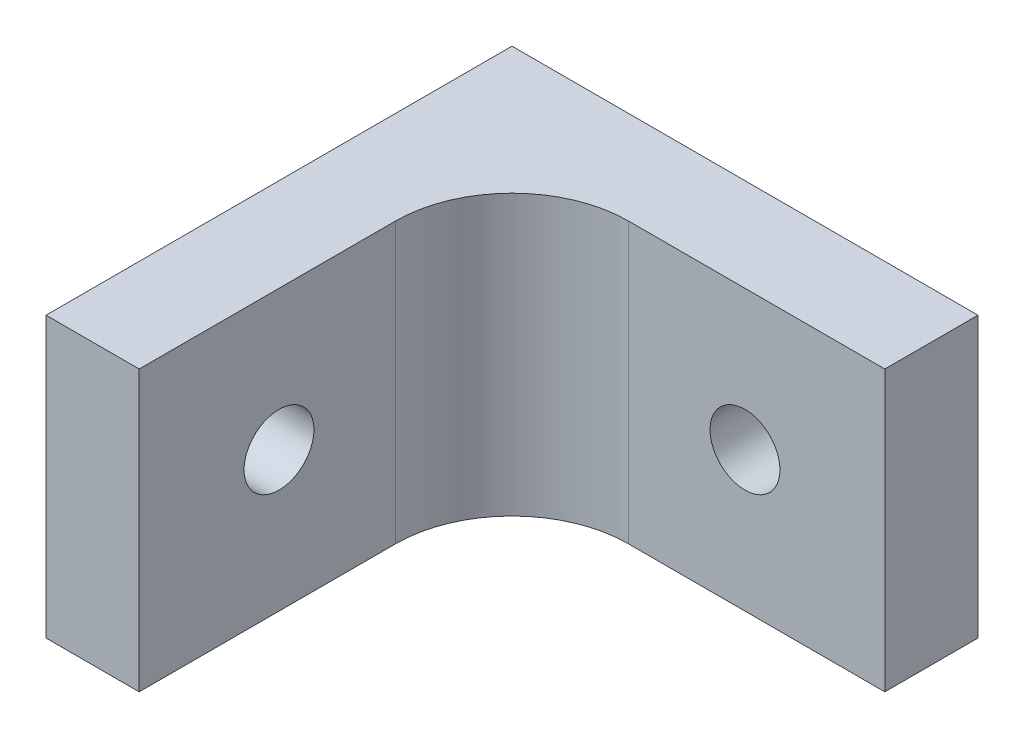
ISO-10303-21;
HEADER;
FILE_DESCRIPTION(('STEP AP214'),'2;1');
FILE_NAME('part.step','',(''),(''),'','','');
FILE_SCHEMA(('AUTOMOTIVE_DESIGN { 1 0 10303 214 1 1 1 1 }'));
ENDSEC;
DATA;
#1=APPLICATION_CONTEXT('core data for automotive mechanical design processes');
#2=APPLICATION_PROTOCOL_DEFINITION('international standard','automotive_design',2000,#1);
#3=PRODUCT_CONTEXT('',#1,'mechanical');
#4=PRODUCT('Part','Part','',(#3));
#5=PRODUCT_RELATED_PRODUCT_CATEGORY('part','',(#4));
#6=PRODUCT_DEFINITION_FORMATION('','',#4);
#7=PRODUCT_DEFINITION_CONTEXT('part definition',#1,'design');
#8=PRODUCT_DEFINITION('design','',#6,#7);
#9=PRODUCT_DEFINITION_SHAPE('','',#8);
#10=(LENGTH_UNIT() NAMED_UNIT(*) SI_UNIT(.MILLI.,.METRE.));
#11=(NAMED_UNIT(*) PLANE_ANGLE_UNIT() SI_UNIT($,.RADIAN.));
#12=(NAMED_UNIT(*) SI_UNIT($,.STERADIAN.) SOLID_ANGLE_UNIT());
#13=UNCERTAINTY_MEASURE_WITH_UNIT(LENGTH_MEASURE(1.E-05),#10,'distance_accuracy_value','');
#14=(GEOMETRIC_REPRESENTATION_CONTEXT(3) GLOBAL_UNCERTAINTY_ASSIGNED_CONTEXT((#13)) GLOBAL_UNIT_ASSIGNED_CONTEXT((#10,
#11,#12)) REPRESENTATION_CONTEXT('',''));
#15=CARTESIAN_POINT('',(0.,0.,0.));
#16=DIRECTION('',(0.,0.,1.));
#17=DIRECTION('',(1.,0.,0.));
#18=AXIS2_PLACEMENT_3D('',#15,#16,#17);
#19=CARTESIAN_POINT('',(0.,0.,2.));
#20=DIRECTION('',(0.,0.,1.));
#21=DIRECTION('',(1.,0.,0.));
#22=AXIS2_PLACEMENT_3D('',#19,#20,#21);
#23=PLANE('',#22);
#24=CARTESIAN_POINT('',(-3.,-3.,2.));
#25=DIRECTION('',(0.,0.,1.));
#26=DIRECTION('',(1.,0.,0.));
#27=AXIS2_PLACEMENT_3D('',#24,#25,#26);
#28=CIRCLE('',#27,0.75);
#29=CARTESIAN_POINT('',(-2.25,-3.,2.));
#30=VERTEX_POINT('',#29);
#31=EDGE_CURVE('E124',#30,#30,#28,.T.);
#32=ORIENTED_EDGE('',*,*,#31,.F.);
#33=EDGE_LOOP('',(#32));
#34=FACE_BOUND('',#33,.T.);
#35=DIRECTION('',(-1.,0.,0.));
#36=VECTOR('',#35,1.);
#37=CARTESIAN_POINT('',(0.,0.,2.));
#38=LINE('',#37,#36);
#39=CARTESIAN_POINT('',(0.,0.,2.));
#40=VERTEX_POINT('',#39);
#41=CARTESIAN_POINT('',(-5.5,0.,2.));
#42=VERTEX_POINT('',#41);
#43=EDGE_CURVE('E135',#40,#42,#38,.T.);
#44=ORIENTED_EDGE('',*,*,#43,.T.);
#45=DIRECTION('',(0.,-1.,0.));
#46=VECTOR('',#45,1.);
#47=CARTESIAN_POINT('',(-5.5,0.,2.));
#48=LINE('',#47,#46);
#49=CARTESIAN_POINT('',(-5.5,-6.00000000000001,2.));
#50=VERTEX_POINT('',#49);
#51=EDGE_CURVE('E156',#42,#50,#48,.T.);
#52=ORIENTED_EDGE('',*,*,#51,.T.);
#53=DIRECTION('',(1.,0.,0.));
#54=VECTOR('',#53,1.);
#55=CARTESIAN_POINT('',(0.,-6.00000000000001,2.));
#56=LINE('',#55,#54);
#57=CARTESIAN_POINT('',(0.,-6.00000000000001,2.));
#58=VERTEX_POINT('',#57);
#59=EDGE_CURVE('E136',#50,#58,#56,.T.);
#60=ORIENTED_EDGE('',*,*,#59,.T.);
#61=DIRECTION('',(0.,1.,0.));
#62=VECTOR('',#61,1.);
#63=CARTESIAN_POINT('',(0.,-6.00000000000001,2.));
#64=LINE('',#63,#62);
#65=EDGE_CURVE('E126',#58,#40,#64,.T.);
#66=ORIENTED_EDGE('',*,*,#65,.T.);
#67=EDGE_LOOP('',(#44,#52,#60,#66));
#68=FACE_BOUND('',#67,.T.);
#69=ADVANCED_FACE('F39',(#34,#68),#23,.T.);
#70=CARTESIAN_POINT('',(0.,0.,0.));
#71=DIRECTION('',(0.,0.,1.));
#72=DIRECTION('',(1.,0.,0.));
#73=AXIS2_PLACEMENT_3D('',#70,#71,#72);
#74=PLANE('',#73);
#75=DIRECTION('',(0.,-1.,0.));
#76=VECTOR('',#75,1.);
#77=CARTESIAN_POINT('',(-10.,-6.00000000000001,0.));
#78=LINE('',#77,#76);
#79=CARTESIAN_POINT('',(-10.,0.,0.));
#80=VERTEX_POINT('',#79);
#81=CARTESIAN_POINT('',(-10.,-6.00000000000001,0.));
#82=VERTEX_POINT('',#81);
#83=EDGE_CURVE('E141',#80,#82,#78,.T.);
#84=ORIENTED_EDGE('',*,*,#83,.F.);
#85=DIRECTION('',(-1.,0.,0.));
#86=VECTOR('',#85,1.);
#87=CARTESIAN_POINT('',(0.,0.,0.));
#88=LINE('',#87,#86);
#89=CARTESIAN_POINT('',(0.,0.,0.));
#90=VERTEX_POINT('',#89);
#91=EDGE_CURVE('E142',#90,#80,#88,.T.);
#92=ORIENTED_EDGE('',*,*,#91,.F.);
#93=DIRECTION('',(0.,1.,0.));
#94=VECTOR('',#93,1.);
#95=CARTESIAN_POINT('',(0.,-6.00000000000001,0.));
#96=LINE('',#95,#94);
#97=CARTESIAN_POINT('',(0.,-6.00000000000001,0.));
#98=VERTEX_POINT('',#97);
#99=EDGE_CURVE('E127',#98,#90,#96,.T.);
#100=ORIENTED_EDGE('',*,*,#99,.F.);
#101=DIRECTION('',(1.,0.,0.));
#102=VECTOR('',#101,1.);
#103=CARTESIAN_POINT('',(0.,-6.00000000000001,0.));
#104=LINE('',#103,#102);
#105=EDGE_CURVE('E134',#82,#98,#104,.T.);
#106=ORIENTED_EDGE('',*,*,#105,.F.);
#107=EDGE_LOOP('',(#84,#92,#100,#106));
#108=FACE_BOUND('',#107,.T.);
#109=CARTESIAN_POINT('',(-3.,-3.,0.));
#110=DIRECTION('',(0.,0.,1.));
#111=DIRECTION('',(1.,0.,0.));
#112=AXIS2_PLACEMENT_3D('',#109,#110,#111);
#113=CIRCLE('',#112,0.75);
#114=CARTESIAN_POINT('',(-2.25,-3.,0.));
#115=VERTEX_POINT('',#114);
#116=EDGE_CURVE('E122',#115,#115,#113,.T.);
#117=ORIENTED_EDGE('',*,*,#116,.T.);
#118=EDGE_LOOP('',(#117));
#119=FACE_BOUND('',#118,.T.);
#120=ADVANCED_FACE('F181',(#108,#119),#74,.F.);
#121=CARTESIAN_POINT('',(0.,-6.00000000000001,2.));
#122=DIRECTION('',(-1.,0.,0.));
#123=DIRECTION('',(0.,-1.,0.));
#124=AXIS2_PLACEMENT_3D('',#121,#122,#123);
#125=PLANE('',#124);
#126=ORIENTED_EDGE('',*,*,#99,.T.);
#127=DIRECTION('',(0.,0.,-1.));
#128=VECTOR('',#127,1.);
#129=CARTESIAN_POINT('',(0.,0.,2.));
#130=LINE('',#129,#128);
#131=EDGE_CURVE('E154',#40,#90,#130,.T.);
#132=ORIENTED_EDGE('',*,*,#131,.F.);
#133=ORIENTED_EDGE('',*,*,#65,.F.);
#134=DIRECTION('',(0.,0.,-1.));
#135=VECTOR('',#134,1.);
#136=CARTESIAN_POINT('',(0.,-6.00000000000001,2.));
#137=LINE('',#136,#135);
#138=EDGE_CURVE('E137',#58,#98,#137,.T.);
#139=ORIENTED_EDGE('',*,*,#138,.T.);
#140=EDGE_LOOP('',(#126,#132,#133,#139));
#141=FACE_BOUND('',#140,.T.);
#142=ADVANCED_FACE('F169',(#141),#125,.F.);
#143=CARTESIAN_POINT('',(0.,0.,2.));
#144=DIRECTION('',(0.,-1.,0.));
#145=DIRECTION('',(0.,0.,-1.));
#146=AXIS2_PLACEMENT_3D('',#143,#144,#145);
#147=PLANE('',#146);
#148=DIRECTION('',(0.,0.,-1.));
#149=VECTOR('',#148,1.);
#150=CARTESIAN_POINT('',(-10.,0.,2.));
#151=LINE('',#150,#149);
#152=CARTESIAN_POINT('',(-10.,0.,10.));
#153=VERTEX_POINT('',#152);
#154=EDGE_CURVE('E148',#153,#80,#151,.T.);
#155=ORIENTED_EDGE('',*,*,#154,.F.);
#156=DIRECTION('',(-1.,0.,0.));
#157=VECTOR('',#156,1.);
#158=CARTESIAN_POINT('',(-8.,0.,10.));
#159=LINE('',#158,#157);
#160=CARTESIAN_POINT('',(-8.,0.,10.));
#161=VERTEX_POINT('',#160);
#162=EDGE_CURVE('E109',#161,#153,#159,.T.);
#163=ORIENTED_EDGE('',*,*,#162,.F.);
#164=DIRECTION('',(0.,0.,-1.));
#165=VECTOR('',#164,1.);
#166=CARTESIAN_POINT('',(-8.,0.,0.));
#167=LINE('',#166,#165);
#168=CARTESIAN_POINT('',(-8.,0.,4.5));
#169=VERTEX_POINT('',#168);
#170=EDGE_CURVE('E111',#161,#169,#167,.T.);
#171=ORIENTED_EDGE('',*,*,#170,.T.);
#172=CARTESIAN_POINT('',(-5.5,0.,4.5));
#173=DIRECTION('',(0.,-1.,0.));
#174=DIRECTION('',(0.,0.,-1.));
#175=AXIS2_PLACEMENT_3D('',#172,#173,#174);
#176=CIRCLE('',#175,2.5);
#177=EDGE_CURVE('E11',#169,#42,#176,.T.);
#178=ORIENTED_EDGE('',*,*,#177,.T.);
#179=ORIENTED_EDGE('',*,*,#43,.F.);
#180=ORIENTED_EDGE('',*,*,#131,.T.);
#181=ORIENTED_EDGE('',*,*,#91,.T.);
#182=EDGE_LOOP('',(#155,#163,#171,#178,#179,#180,#181));
#183=FACE_BOUND('',#182,.T.);
#184=ADVANCED_FACE('F171',(#183),#147,.F.);
#185=CARTESIAN_POINT('',(-10.,-6.00000000000001,2.));
#186=DIRECTION('',(1.,0.,0.));
#187=DIRECTION('',(0.,0.,-1.));
#188=AXIS2_PLACEMENT_3D('',#185,#186,#187);
#189=PLANE('',#188);
#190=ORIENTED_EDGE('',*,*,#83,.T.);
#191=DIRECTION('',(0.,0.,-1.));
#192=VECTOR('',#191,1.);
#193=CARTESIAN_POINT('',(-10.,-6.00000000000001,2.));
#194=LINE('',#193,#192);
#195=CARTESIAN_POINT('',(-10.,-6.,10.));
#196=VERTEX_POINT('',#195);
#197=EDGE_CURVE('E149',#196,#82,#194,.T.);
#198=ORIENTED_EDGE('',*,*,#197,.F.);
#199=DIRECTION('',(0.,1.,0.));
#200=VECTOR('',#199,1.);
#201=CARTESIAN_POINT('',(-10.,0.,10.));
#202=LINE('',#201,#200);
#203=EDGE_CURVE('E101',#196,#153,#202,.T.);
#204=ORIENTED_EDGE('',*,*,#203,.T.);
#205=ORIENTED_EDGE('',*,*,#154,.T.);
#206=EDGE_LOOP('',(#190,#198,#204,#205));
#207=FACE_BOUND('',#206,.T.);
#208=CARTESIAN_POINT('',(-10.,-3.,7.));
#209=DIRECTION('',(-1.,0.,0.));
#210=DIRECTION('',(0.,0.,1.));
#211=AXIS2_PLACEMENT_3D('',#208,#209,#210);
#212=CIRCLE('',#211,0.749999999999999);
#213=CARTESIAN_POINT('',(-10.,-3.,7.75));
#214=VERTEX_POINT('',#213);
#215=EDGE_CURVE('E281',#214,#214,#212,.T.);
#216=ORIENTED_EDGE('',*,*,#215,.F.);
#217=EDGE_LOOP('',(#216));
#218=FACE_BOUND('',#217,.T.);
#219=ADVANCED_FACE('F200',(#207,#218),#189,.F.);
#220=CARTESIAN_POINT('',(0.,-6.00000000000001,2.));
#221=DIRECTION('',(0.,1.,0.));
#222=DIRECTION('',(0.,0.,1.));
#223=AXIS2_PLACEMENT_3D('',#220,#221,#222);
#224=PLANE('',#223);
#225=ORIENTED_EDGE('',*,*,#105,.T.);
#226=ORIENTED_EDGE('',*,*,#138,.F.);
#227=ORIENTED_EDGE('',*,*,#59,.F.);
#228=CARTESIAN_POINT('',(-5.5,-6.00000000000001,4.5));
#229=DIRECTION('',(0.,1.,0.));
#230=DIRECTION('',(0.,0.,1.));
#231=AXIS2_PLACEMENT_3D('',#228,#229,#230);
#232=CIRCLE('',#231,2.5);
#233=CARTESIAN_POINT('',(-8.,-6.,4.5));
#234=VERTEX_POINT('',#233);
#235=EDGE_CURVE('E50',#50,#234,#232,.T.);
#236=ORIENTED_EDGE('',*,*,#235,.T.);
#237=DIRECTION('',(0.,0.,1.));
#238=VECTOR('',#237,1.);
#239=CARTESIAN_POINT('',(-8.,-6.,0.));
#240=LINE('',#239,#238);
#241=CARTESIAN_POINT('',(-8.,-6.,10.));
#242=VERTEX_POINT('',#241);
#243=EDGE_CURVE('E94',#234,#242,#240,.T.);
#244=ORIENTED_EDGE('',*,*,#243,.T.);
#245=DIRECTION('',(-1.,0.,0.));
#246=VECTOR('',#245,1.);
#247=CARTESIAN_POINT('',(-8.,-6.,10.));
#248=LINE('',#247,#246);
#249=EDGE_CURVE('E100',#242,#196,#248,.T.);
#250=ORIENTED_EDGE('',*,*,#249,.T.);
#251=ORIENTED_EDGE('',*,*,#197,.T.);
#252=EDGE_LOOP('',(#225,#226,#227,#236,#244,#250,#251));
#253=FACE_BOUND('',#252,.T.);
#254=ADVANCED_FACE('F97',(#253),#224,.F.);
#255=CARTESIAN_POINT('',(-3.,-3.,2.));
#256=DIRECTION('',(0.,0.,-1.));
#257=DIRECTION('',(-1.,0.,0.));
#258=AXIS2_PLACEMENT_3D('',#255,#256,#257);
#259=CYLINDRICAL_SURFACE('',#258,0.75);
#260=ORIENTED_EDGE('',*,*,#31,.T.);
#261=EDGE_LOOP('',(#260));
#262=FACE_BOUND('',#261,.T.);
#263=ORIENTED_EDGE('',*,*,#116,.F.);
#264=EDGE_LOOP('',(#263));
#265=FACE_BOUND('',#264,.T.);
#266=ADVANCED_FACE('F195',(#262,#265),#259,.F.);
#267=CARTESIAN_POINT('',(-8.,0.,10.));
#268=DIRECTION('',(0.,0.,1.));
#269=DIRECTION('',(1.,0.,0.));
#270=AXIS2_PLACEMENT_3D('',#267,#268,#269);
#271=PLANE('',#270);
#272=ORIENTED_EDGE('',*,*,#203,.F.);
#273=ORIENTED_EDGE('',*,*,#249,.F.);
#274=DIRECTION('',(0.,1.,0.));
#275=VECTOR('',#274,1.);
#276=CARTESIAN_POINT('',(-8.,0.,10.));
#277=LINE('',#276,#275);
#278=EDGE_CURVE('E105',#242,#161,#277,.T.);
#279=ORIENTED_EDGE('',*,*,#278,.T.);
#280=ORIENTED_EDGE('',*,*,#162,.T.);
#281=EDGE_LOOP('',(#272,#273,#279,#280));
#282=FACE_BOUND('',#281,.T.);
#283=ADVANCED_FACE('F110',(#282),#271,.T.);
#284=CARTESIAN_POINT('',(-8.,0.,0.));
#285=DIRECTION('',(-1.,0.,0.));
#286=DIRECTION('',(0.,0.,1.));
#287=AXIS2_PLACEMENT_3D('',#284,#285,#286);
#288=PLANE('',#287);
#289=ORIENTED_EDGE('',*,*,#243,.F.);
#290=DIRECTION('',(0.,-1.,0.));
#291=VECTOR('',#290,1.);
#292=CARTESIAN_POINT('',(-8.,0.,4.5));
#293=LINE('',#292,#291);
#294=EDGE_CURVE('E58',#234,#169,#293,.F.);
#295=ORIENTED_EDGE('',*,*,#294,.T.);
#296=ORIENTED_EDGE('',*,*,#170,.F.);
#297=ORIENTED_EDGE('',*,*,#278,.F.);
#298=EDGE_LOOP('',(#289,#295,#296,#297));
#299=FACE_BOUND('',#298,.T.);
#300=CARTESIAN_POINT('',(-8.,-3.,7.));
#301=DIRECTION('',(-1.,0.,0.));
#302=DIRECTION('',(0.,0.,1.));
#303=AXIS2_PLACEMENT_3D('',#300,#301,#302);
#304=CIRCLE('',#303,0.749999999999999);
#305=CARTESIAN_POINT('',(-8.,-3.,7.75));
#306=VERTEX_POINT('',#305);
#307=EDGE_CURVE('E119',#306,#306,#304,.T.);
#308=ORIENTED_EDGE('',*,*,#307,.T.);
#309=EDGE_LOOP('',(#308));
#310=FACE_BOUND('',#309,.T.);
#311=ADVANCED_FACE('F113',(#299,#310),#288,.F.);
#312=CARTESIAN_POINT('',(-8.,-3.,7.));
#313=DIRECTION('',(-1.,0.,0.));
#314=DIRECTION('',(0.,0.,1.));
#315=AXIS2_PLACEMENT_3D('',#312,#313,#314);
#316=CYLINDRICAL_SURFACE('',#315,0.749999999999999);
#317=ORIENTED_EDGE('',*,*,#307,.F.);
#318=EDGE_LOOP('',(#317));
#319=FACE_BOUND('',#318,.T.);
#320=ORIENTED_EDGE('',*,*,#215,.T.);
#321=EDGE_LOOP('',(#320));
#322=FACE_BOUND('',#321,.T.);
#323=ADVANCED_FACE('F173',(#319,#322),#316,.F.);
#324=CARTESIAN_POINT('',(-5.5,0.,4.5));
#325=DIRECTION('',(0.,-1.,0.));
#326=DIRECTION('',(0.,0.,-1.));
#327=AXIS2_PLACEMENT_3D('',#324,#325,#326);
#328=CYLINDRICAL_SURFACE('',#327,2.5);
#329=ORIENTED_EDGE('',*,*,#177,.F.);
#330=ORIENTED_EDGE('',*,*,#294,.F.);
#331=ORIENTED_EDGE('',*,*,#235,.F.);
#332=ORIENTED_EDGE('',*,*,#51,.F.);
#333=EDGE_LOOP('',(#329,#330,#331,#332));
#334=FACE_BOUND('',#333,.T.);
#335=ADVANCED_FACE('F41',(#334),#328,.F.);
#336=CLOSED_SHELL('',(#69,#120,#142,#184,#219,#254,#266,#283,#311,#323,#335));
#337=MANIFOLD_SOLID_BREP('B2',#336);
#338=ADVANCED_BREP_SHAPE_REPRESENTATION('',(#18,#337),#14);
#339=SHAPE_DEFINITION_REPRESENTATION(#9,#338);
ENDSEC;
END-ISO-10303-21;
